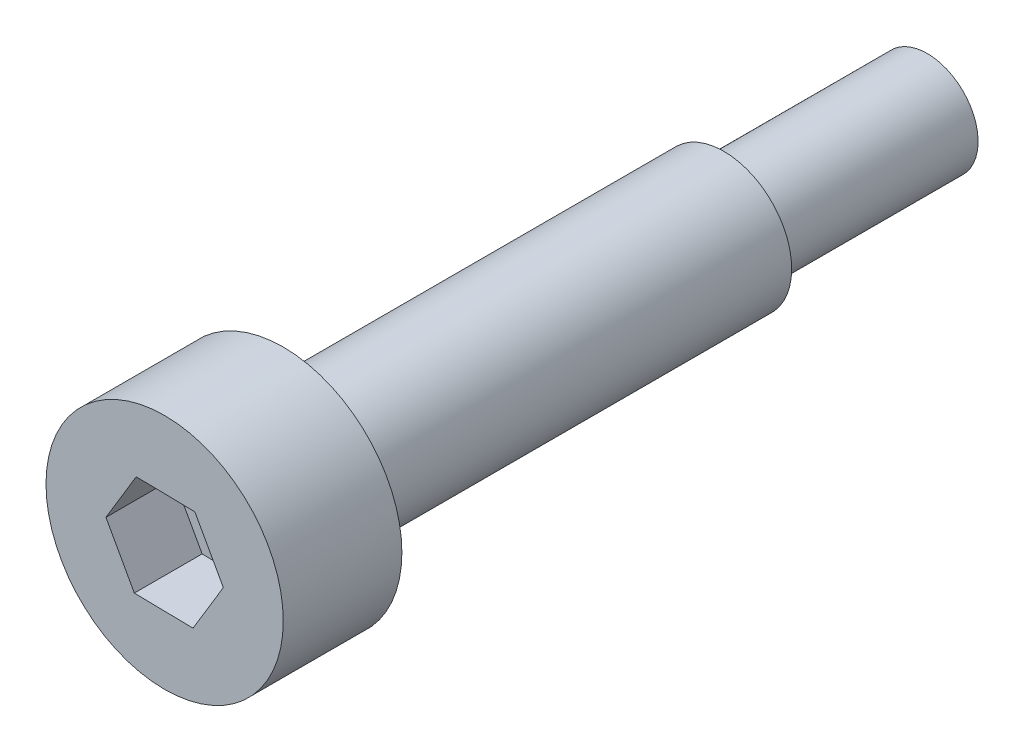
ISO-10303-21;
HEADER;
FILE_DESCRIPTION(('STEP AP214'),'2;1');
FILE_NAME('part.step','',(''),(''),'','','');
FILE_SCHEMA(('AUTOMOTIVE_DESIGN { 1 0 10303 214 1 1 1 1 }'));
ENDSEC;
DATA;
#1=APPLICATION_CONTEXT('core data for automotive mechanical design processes');
#2=APPLICATION_PROTOCOL_DEFINITION('international standard','automotive_design',2000,#1);
#3=PRODUCT_CONTEXT('',#1,'mechanical');
#4=PRODUCT('Part','Part','',(#3));
#5=PRODUCT_RELATED_PRODUCT_CATEGORY('part','',(#4));
#6=PRODUCT_DEFINITION_FORMATION('','',#4);
#7=PRODUCT_DEFINITION_CONTEXT('part definition',#1,'design');
#8=PRODUCT_DEFINITION('design','',#6,#7);
#9=PRODUCT_DEFINITION_SHAPE('','',#8);
#10=(LENGTH_UNIT() NAMED_UNIT(*) SI_UNIT(.MILLI.,.METRE.));
#11=(NAMED_UNIT(*) PLANE_ANGLE_UNIT() SI_UNIT($,.RADIAN.));
#12=(NAMED_UNIT(*) SI_UNIT($,.STERADIAN.) SOLID_ANGLE_UNIT());
#13=UNCERTAINTY_MEASURE_WITH_UNIT(LENGTH_MEASURE(1.E-05),#10,'distance_accuracy_value','');
#14=(GEOMETRIC_REPRESENTATION_CONTEXT(3) GLOBAL_UNCERTAINTY_ASSIGNED_CONTEXT((#13)) GLOBAL_UNIT_ASSIGNED_CONTEXT((#10,
#11,#12)) REPRESENTATION_CONTEXT('',''));
#15=CARTESIAN_POINT('',(0.,0.,0.));
#16=DIRECTION('',(0.,0.,1.));
#17=DIRECTION('',(1.,0.,0.));
#18=AXIS2_PLACEMENT_3D('',#15,#16,#17);
#19=CARTESIAN_POINT('',(0.,0.,3.5));
#20=DIRECTION('',(0.,0.,-1.));
#21=DIRECTION('',(-1.,0.,0.));
#22=AXIS2_PLACEMENT_3D('',#19,#20,#21);
#23=CYLINDRICAL_SURFACE('',#22,3.5);
#24=CARTESIAN_POINT('',(0.,0.,3.5));
#25=DIRECTION('',(0.,0.,1.));
#26=DIRECTION('',(1.,0.,0.));
#27=AXIS2_PLACEMENT_3D('',#24,#25,#26);
#28=CIRCLE('',#27,3.5);
#29=CARTESIAN_POINT('',(3.5,0.,3.5));
#30=VERTEX_POINT('',#29);
#31=EDGE_CURVE('E43',#30,#30,#28,.T.);
#32=ORIENTED_EDGE('',*,*,#31,.F.);
#33=EDGE_LOOP('',(#32));
#34=FACE_BOUND('',#33,.T.);
#35=CARTESIAN_POINT('',(0.,0.,0.));
#36=DIRECTION('',(0.,0.,1.));
#37=DIRECTION('',(1.,0.,0.));
#38=AXIS2_PLACEMENT_3D('',#35,#36,#37);
#39=CIRCLE('',#38,3.5);
#40=CARTESIAN_POINT('',(3.5,0.,0.));
#41=VERTEX_POINT('',#40);
#42=EDGE_CURVE('E138',#41,#41,#39,.T.);
#43=ORIENTED_EDGE('',*,*,#42,.T.);
#44=EDGE_LOOP('',(#43));
#45=FACE_BOUND('',#44,.T.);
#46=ADVANCED_FACE('F36',(#34,#45),#23,.T.);
#47=CARTESIAN_POINT('',(0.,0.,3.5));
#48=DIRECTION('',(0.,0.,1.));
#49=DIRECTION('',(1.,0.,0.));
#50=AXIS2_PLACEMENT_3D('',#47,#48,#49);
#51=PLANE('',#50);
#52=DIRECTION('',(-0.483885708586405,0.875131202178183,0.));
#53=VECTOR('',#52,1.);
#54=CARTESIAN_POINT('',(1.73175411943134,-0.0320572898511147,3.5));
#55=LINE('',#54,#53);
#56=CARTESIAN_POINT('',(1.73175411943134,-0.0320572898511147,3.5));
#57=VERTEX_POINT('',#56);
#58=CARTESIAN_POINT('',(0.893639487103215,1.48371441561033,3.5));
#59=VERTEX_POINT('',#58);
#60=EDGE_CURVE('E50',#57,#59,#55,.T.);
#61=ORIENTED_EDGE('',*,*,#60,.F.);
#62=DIRECTION('',(0.51594299843752,0.856622917253152,0.));
#63=VECTOR('',#62,1.);
#64=CARTESIAN_POINT('',(0.838114632328121,-1.51577170546145,3.5));
#65=LINE('',#64,#63);
#66=CARTESIAN_POINT('',(0.838114632328121,-1.51577170546145,3.5));
#67=VERTEX_POINT('',#66);
#68=EDGE_CURVE('E134',#67,#57,#65,.T.);
#69=ORIENTED_EDGE('',*,*,#68,.F.);
#70=DIRECTION('',(0.999828707023925,-0.0185082849250311,0.));
#71=VECTOR('',#70,1.);
#72=CARTESIAN_POINT('',(-0.893639487103214,-1.48371441561033,3.5));
#73=LINE('',#72,#71);
#74=CARTESIAN_POINT('',(-0.893639487103214,-1.48371441561033,3.5));
#75=VERTEX_POINT('',#74);
#76=EDGE_CURVE('E132',#75,#67,#73,.T.);
#77=ORIENTED_EDGE('',*,*,#76,.F.);
#78=DIRECTION('',(0.483885708586405,-0.875131202178183,0.));
#79=VECTOR('',#78,1.);
#80=CARTESIAN_POINT('',(-1.73175411943134,0.0320572898511147,3.5));
#81=LINE('',#80,#79);
#82=CARTESIAN_POINT('',(-1.73175411943134,0.0320572898511147,3.5));
#83=VERTEX_POINT('',#82);
#84=EDGE_CURVE('E98',#83,#75,#81,.T.);
#85=ORIENTED_EDGE('',*,*,#84,.F.);
#86=DIRECTION('',(-0.51594299843752,-0.856622917253152,0.));
#87=VECTOR('',#86,1.);
#88=CARTESIAN_POINT('',(-0.838114632328121,1.51577170546145,3.5));
#89=LINE('',#88,#87);
#90=CARTESIAN_POINT('',(-0.838114632328121,1.51577170546145,3.5));
#91=VERTEX_POINT('',#90);
#92=EDGE_CURVE('E128',#91,#83,#89,.T.);
#93=ORIENTED_EDGE('',*,*,#92,.F.);
#94=DIRECTION('',(-0.999828707023925,0.0185082849250311,0.));
#95=VECTOR('',#94,1.);
#96=CARTESIAN_POINT('',(0.893639487103215,1.48371441561033,3.5));
#97=LINE('',#96,#95);
#98=EDGE_CURVE('E124',#59,#91,#97,.T.);
#99=ORIENTED_EDGE('',*,*,#98,.F.);
#100=EDGE_LOOP('',(#61,#69,#77,#85,#93,#99));
#101=FACE_BOUND('',#100,.T.);
#102=ORIENTED_EDGE('',*,*,#31,.T.);
#103=EDGE_LOOP('',(#102));
#104=FACE_BOUND('',#103,.T.);
#105=ADVANCED_FACE('F152',(#101,#104),#51,.T.);
#106=CARTESIAN_POINT('',(0.,0.,0.));
#107=DIRECTION('',(0.,0.,1.));
#108=DIRECTION('',(1.,0.,0.));
#109=AXIS2_PLACEMENT_3D('',#106,#107,#108);
#110=PLANE('',#109);
#111=CARTESIAN_POINT('',(0.,0.,0.));
#112=DIRECTION('',(0.,0.,1.));
#113=DIRECTION('',(1.,0.,0.));
#114=AXIS2_PLACEMENT_3D('',#111,#112,#113);
#115=CIRCLE('',#114,2.);
#116=CARTESIAN_POINT('',(2.,0.,0.));
#117=VERTEX_POINT('',#116);
#118=EDGE_CURVE('E11',#117,#117,#115,.F.);
#119=ORIENTED_EDGE('',*,*,#118,.F.);
#120=EDGE_LOOP('',(#119));
#121=FACE_BOUND('',#120,.T.);
#122=ORIENTED_EDGE('',*,*,#42,.F.);
#123=EDGE_LOOP('',(#122));
#124=FACE_BOUND('',#123,.T.);
#125=ADVANCED_FACE('F149',(#121,#124),#110,.F.);
#126=CARTESIAN_POINT('',(1.73175411943134,-0.0320572898511147,1.5));
#127=DIRECTION('',(0.875131202178183,0.483885708586405,0.));
#128=DIRECTION('',(-0.483885708586405,0.875131202178183,0.));
#129=AXIS2_PLACEMENT_3D('',#126,#127,#128);
#130=PLANE('',#129);
#131=ORIENTED_EDGE('',*,*,#60,.T.);
#132=DIRECTION('',(0.,0.,1.));
#133=VECTOR('',#132,1.);
#134=CARTESIAN_POINT('',(0.893639487103215,1.48371441561033,1.5));
#135=LINE('',#134,#133);
#136=CARTESIAN_POINT('',(0.893639487103215,1.48371441561033,1.5));
#137=VERTEX_POINT('',#136);
#138=EDGE_CURVE('E80',#137,#59,#135,.T.);
#139=ORIENTED_EDGE('',*,*,#138,.F.);
#140=DIRECTION('',(-0.483885708586405,0.875131202178183,0.));
#141=VECTOR('',#140,1.);
#142=CARTESIAN_POINT('',(1.73175411943134,-0.0320572898511147,1.5));
#143=LINE('',#142,#141);
#144=CARTESIAN_POINT('',(1.73175411943134,-0.0320572898511147,1.5));
#145=VERTEX_POINT('',#144);
#146=EDGE_CURVE('E136',#145,#137,#143,.T.);
#147=ORIENTED_EDGE('',*,*,#146,.F.);
#148=DIRECTION('',(0.,0.,1.));
#149=VECTOR('',#148,1.);
#150=CARTESIAN_POINT('',(1.73175411943134,-0.0320572898511147,1.5));
#151=LINE('',#150,#149);
#152=EDGE_CURVE('E58',#145,#57,#151,.T.);
#153=ORIENTED_EDGE('',*,*,#152,.T.);
#154=EDGE_LOOP('',(#131,#139,#147,#153));
#155=FACE_BOUND('',#154,.T.);
#156=ADVANCED_FACE('F151',(#155),#130,.F.);
#157=CARTESIAN_POINT('',(0.838114632328121,-1.51577170546145,1.5));
#158=DIRECTION('',(0.856622917253152,-0.51594299843752,0.));
#159=DIRECTION('',(0.51594299843752,0.856622917253153,0.));
#160=AXIS2_PLACEMENT_3D('',#157,#158,#159);
#161=PLANE('',#160);
#162=ORIENTED_EDGE('',*,*,#68,.T.);
#163=ORIENTED_EDGE('',*,*,#152,.F.);
#164=DIRECTION('',(0.51594299843752,0.856622917253152,0.));
#165=VECTOR('',#164,1.);
#166=CARTESIAN_POINT('',(0.838114632328121,-1.51577170546145,1.5));
#167=LINE('',#166,#165);
#168=CARTESIAN_POINT('',(0.838114632328121,-1.51577170546145,1.5));
#169=VERTEX_POINT('',#168);
#170=EDGE_CURVE('E110',#169,#145,#167,.T.);
#171=ORIENTED_EDGE('',*,*,#170,.F.);
#172=DIRECTION('',(0.,0.,1.));
#173=VECTOR('',#172,1.);
#174=CARTESIAN_POINT('',(0.838114632328121,-1.51577170546145,1.5));
#175=LINE('',#174,#173);
#176=EDGE_CURVE('E102',#169,#67,#175,.T.);
#177=ORIENTED_EDGE('',*,*,#176,.T.);
#178=EDGE_LOOP('',(#162,#163,#171,#177));
#179=FACE_BOUND('',#178,.T.);
#180=ADVANCED_FACE('F158',(#179),#161,.F.);
#181=CARTESIAN_POINT('',(-0.893639487103214,-1.48371441561033,1.5));
#182=DIRECTION('',(-0.0185082849250311,-0.999828707023925,0.));
#183=DIRECTION('',(0.999828707023925,-0.0185082849250311,0.));
#184=AXIS2_PLACEMENT_3D('',#181,#182,#183);
#185=PLANE('',#184);
#186=ORIENTED_EDGE('',*,*,#76,.T.);
#187=ORIENTED_EDGE('',*,*,#176,.F.);
#188=DIRECTION('',(0.999828707023925,-0.0185082849250311,0.));
#189=VECTOR('',#188,1.);
#190=CARTESIAN_POINT('',(-0.893639487103214,-1.48371441561033,1.5));
#191=LINE('',#190,#189);
#192=CARTESIAN_POINT('',(-0.893639487103214,-1.48371441561033,1.5));
#193=VERTEX_POINT('',#192);
#194=EDGE_CURVE('E106',#193,#169,#191,.T.);
#195=ORIENTED_EDGE('',*,*,#194,.F.);
#196=DIRECTION('',(0.,0.,1.));
#197=VECTOR('',#196,1.);
#198=CARTESIAN_POINT('',(-0.893639487103214,-1.48371441561033,1.5));
#199=LINE('',#198,#197);
#200=EDGE_CURVE('E91',#193,#75,#199,.T.);
#201=ORIENTED_EDGE('',*,*,#200,.T.);
#202=EDGE_LOOP('',(#186,#187,#195,#201));
#203=FACE_BOUND('',#202,.T.);
#204=ADVANCED_FACE('F107',(#203),#185,.F.);
#205=CARTESIAN_POINT('',(-1.73175411943134,0.0320572898511147,1.5));
#206=DIRECTION('',(-0.875131202178183,-0.483885708586405,0.));
#207=DIRECTION('',(0.483885708586405,-0.875131202178183,0.));
#208=AXIS2_PLACEMENT_3D('',#205,#206,#207);
#209=PLANE('',#208);
#210=ORIENTED_EDGE('',*,*,#84,.T.);
#211=ORIENTED_EDGE('',*,*,#200,.F.);
#212=DIRECTION('',(0.483885708586405,-0.875131202178183,0.));
#213=VECTOR('',#212,1.);
#214=CARTESIAN_POINT('',(-1.73175411943134,0.0320572898511147,1.5));
#215=LINE('',#214,#213);
#216=CARTESIAN_POINT('',(-1.73175411943134,0.0320572898511147,1.5));
#217=VERTEX_POINT('',#216);
#218=EDGE_CURVE('E95',#217,#193,#215,.T.);
#219=ORIENTED_EDGE('',*,*,#218,.F.);
#220=DIRECTION('',(0.,0.,1.));
#221=VECTOR('',#220,1.);
#222=CARTESIAN_POINT('',(-1.73175411943134,0.0320572898511147,1.5));
#223=LINE('',#222,#221);
#224=EDGE_CURVE('E103',#217,#83,#223,.T.);
#225=ORIENTED_EDGE('',*,*,#224,.T.);
#226=EDGE_LOOP('',(#210,#211,#219,#225));
#227=FACE_BOUND('',#226,.T.);
#228=ADVANCED_FACE('F93',(#227),#209,.F.);
#229=CARTESIAN_POINT('',(-0.838114632328121,1.51577170546145,1.5));
#230=DIRECTION('',(-0.856622917253152,0.51594299843752,0.));
#231=DIRECTION('',(-0.51594299843752,-0.856622917253153,0.));
#232=AXIS2_PLACEMENT_3D('',#229,#230,#231);
#233=PLANE('',#232);
#234=ORIENTED_EDGE('',*,*,#92,.T.);
#235=ORIENTED_EDGE('',*,*,#224,.F.);
#236=DIRECTION('',(-0.51594299843752,-0.856622917253152,0.));
#237=VECTOR('',#236,1.);
#238=CARTESIAN_POINT('',(-0.838114632328121,1.51577170546145,1.5));
#239=LINE('',#238,#237);
#240=CARTESIAN_POINT('',(-0.838114632328121,1.51577170546145,1.5));
#241=VERTEX_POINT('',#240);
#242=EDGE_CURVE('E116',#241,#217,#239,.T.);
#243=ORIENTED_EDGE('',*,*,#242,.F.);
#244=DIRECTION('',(0.,0.,1.));
#245=VECTOR('',#244,1.);
#246=CARTESIAN_POINT('',(-0.838114632328121,1.51577170546145,1.5));
#247=LINE('',#246,#245);
#248=EDGE_CURVE('E141',#241,#91,#247,.T.);
#249=ORIENTED_EDGE('',*,*,#248,.T.);
#250=EDGE_LOOP('',(#234,#235,#243,#249));
#251=FACE_BOUND('',#250,.T.);
#252=ADVANCED_FACE('F205',(#251),#233,.F.);
#253=CARTESIAN_POINT('',(0.893639487103215,1.48371441561033,1.5));
#254=DIRECTION('',(0.0185082849250311,0.999828707023925,0.));
#255=DIRECTION('',(-0.999828707023925,0.0185082849250311,0.));
#256=AXIS2_PLACEMENT_3D('',#253,#254,#255);
#257=PLANE('',#256);
#258=ORIENTED_EDGE('',*,*,#98,.T.);
#259=ORIENTED_EDGE('',*,*,#248,.F.);
#260=DIRECTION('',(-0.999828707023925,0.0185082849250311,0.));
#261=VECTOR('',#260,1.);
#262=CARTESIAN_POINT('',(0.893639487103215,1.48371441561033,1.5));
#263=LINE('',#262,#261);
#264=EDGE_CURVE('E118',#137,#241,#263,.T.);
#265=ORIENTED_EDGE('',*,*,#264,.F.);
#266=ORIENTED_EDGE('',*,*,#138,.T.);
#267=EDGE_LOOP('',(#258,#259,#265,#266));
#268=FACE_BOUND('',#267,.T.);
#269=ADVANCED_FACE('F214',(#268),#257,.F.);
#270=CARTESIAN_POINT('',(0.,0.,1.5));
#271=DIRECTION('',(0.,0.,1.));
#272=DIRECTION('',(1.,0.,0.));
#273=AXIS2_PLACEMENT_3D('',#270,#271,#272);
#274=PLANE('',#273);
#275=ORIENTED_EDGE('',*,*,#146,.T.);
#276=ORIENTED_EDGE('',*,*,#264,.T.);
#277=ORIENTED_EDGE('',*,*,#242,.T.);
#278=ORIENTED_EDGE('',*,*,#218,.T.);
#279=ORIENTED_EDGE('',*,*,#194,.T.);
#280=ORIENTED_EDGE('',*,*,#170,.T.);
#281=EDGE_LOOP('',(#275,#276,#277,#278,#279,#280));
#282=FACE_BOUND('',#281,.T.);
#283=ADVANCED_FACE('F113',(#282),#274,.T.);
#284=CARTESIAN_POINT('',(0.,0.,-13.));
#285=DIRECTION('',(0.,0.,1.));
#286=DIRECTION('',(1.,0.,0.));
#287=AXIS2_PLACEMENT_3D('',#284,#285,#286);
#288=CYLINDRICAL_SURFACE('',#287,2.);
#289=CARTESIAN_POINT('',(0.,0.,-13.));
#290=DIRECTION('',(0.,0.,-1.));
#291=DIRECTION('',(-1.,0.,0.));
#292=AXIS2_PLACEMENT_3D('',#289,#290,#291);
#293=CIRCLE('',#292,2.);
#294=CARTESIAN_POINT('',(2.,0.,-13.));
#295=VERTEX_POINT('',#294);
#296=EDGE_CURVE('E125',#295,#295,#293,.T.);
#297=CARTESIAN_POINT('',(2.,0.,-13.));
#298=CARTESIAN_POINT('',(2.,0.,-12.8645833333333));
#299=CARTESIAN_POINT('',(2.,0.,-12.7291666666667));
#300=CARTESIAN_POINT('',(2.,0.,-12.4583333333333));
#301=CARTESIAN_POINT('',(2.,0.,-12.3229166666667));
#302=CARTESIAN_POINT('',(2.,0.,-12.0520833333333));
#303=CARTESIAN_POINT('',(2.,0.,-11.9166666666667));
#304=CARTESIAN_POINT('',(2.,0.,-11.6458333333333));
#305=CARTESIAN_POINT('',(2.,0.,-11.5104166666667));
#306=CARTESIAN_POINT('',(2.,0.,-11.2395833333333));
#307=CARTESIAN_POINT('',(2.,0.,-11.1041666666667));
#308=CARTESIAN_POINT('',(2.,0.,-10.8333333333333));
#309=CARTESIAN_POINT('',(2.,0.,-10.6979166666667));
#310=CARTESIAN_POINT('',(2.,0.,-10.4270833333333));
#311=CARTESIAN_POINT('',(2.,0.,-10.2916666666667));
#312=CARTESIAN_POINT('',(2.,0.,-10.0208333333333));
#313=CARTESIAN_POINT('',(2.,0.,-9.88541666666667));
#314=CARTESIAN_POINT('',(2.,0.,-9.61458333333333));
#315=CARTESIAN_POINT('',(2.,0.,-9.47916666666667));
#316=CARTESIAN_POINT('',(2.,0.,-9.20833333333333));
#317=CARTESIAN_POINT('',(2.,0.,-9.07291666666666));
#318=CARTESIAN_POINT('',(2.,0.,-8.80208333333333));
#319=CARTESIAN_POINT('',(2.,0.,-8.66666666666667));
#320=CARTESIAN_POINT('',(2.,0.,-8.39583333333333));
#321=CARTESIAN_POINT('',(2.,0.,-8.26041666666667));
#322=CARTESIAN_POINT('',(2.,0.,-7.98958333333333));
#323=CARTESIAN_POINT('',(2.,0.,-7.85416666666667));
#324=CARTESIAN_POINT('',(2.,0.,-7.58333333333333));
#325=CARTESIAN_POINT('',(2.,0.,-7.44791666666667));
#326=CARTESIAN_POINT('',(2.,0.,-7.17708333333333));
#327=CARTESIAN_POINT('',(2.,0.,-7.04166666666667));
#328=CARTESIAN_POINT('',(2.,0.,-6.77083333333333));
#329=CARTESIAN_POINT('',(2.,0.,-6.63541666666667));
#330=CARTESIAN_POINT('',(2.,0.,-6.36458333333333));
#331=CARTESIAN_POINT('',(2.,0.,-6.22916666666667));
#332=CARTESIAN_POINT('',(2.,0.,-5.95833333333333));
#333=CARTESIAN_POINT('',(2.,0.,-5.82291666666667));
#334=CARTESIAN_POINT('',(2.,0.,-5.55208333333333));
#335=CARTESIAN_POINT('',(2.,0.,-5.41666666666667));
#336=CARTESIAN_POINT('',(2.,0.,-5.14583333333333));
#337=CARTESIAN_POINT('',(2.,0.,-5.01041666666667));
#338=CARTESIAN_POINT('',(2.,0.,-4.73958333333333));
#339=CARTESIAN_POINT('',(2.,0.,-4.60416666666667));
#340=CARTESIAN_POINT('',(2.,0.,-4.33333333333333));
#341=CARTESIAN_POINT('',(2.,0.,-4.19791666666667));
#342=CARTESIAN_POINT('',(2.,0.,-3.92708333333333));
#343=CARTESIAN_POINT('',(2.,0.,-3.79166666666667));
#344=CARTESIAN_POINT('',(2.,0.,-3.52083333333333));
#345=CARTESIAN_POINT('',(2.,0.,-3.38541666666667));
#346=CARTESIAN_POINT('',(2.,0.,-3.11458333333333));
#347=CARTESIAN_POINT('',(2.,0.,-2.97916666666667));
#348=CARTESIAN_POINT('',(2.,0.,-2.70833333333333));
#349=CARTESIAN_POINT('',(2.,0.,-2.57291666666667));
#350=CARTESIAN_POINT('',(2.,0.,-2.30208333333333));
#351=CARTESIAN_POINT('',(2.,0.,-2.16666666666667));
#352=CARTESIAN_POINT('',(2.,0.,-1.89583333333333));
#353=CARTESIAN_POINT('',(2.,0.,-1.76041666666667));
#354=CARTESIAN_POINT('',(2.,0.,-1.48958333333333));
#355=CARTESIAN_POINT('',(2.,0.,-1.35416666666667));
#356=CARTESIAN_POINT('',(2.,0.,-1.08333333333333));
#357=CARTESIAN_POINT('',(2.,0.,-0.947916666666667));
#358=CARTESIAN_POINT('',(2.,0.,-0.677083333333334));
#359=CARTESIAN_POINT('',(2.,0.,-0.541666666666667));
#360=CARTESIAN_POINT('',(2.,0.,-0.270833333333334));
#361=CARTESIAN_POINT('',(2.,0.,-0.135416666666667));
#362=CARTESIAN_POINT('',(2.,0.,0.));
#363=B_SPLINE_CURVE_WITH_KNOTS('',3,(#297,#298,#299,#300,#301,#302,#303,#304,#305,#306,#307,
#308,#309,#310,#311,#312,#313,#314,#315,#316,#317,#318,#319,#320,#321,#322,#323,#324,#325,#326,
#327,#328,#329,#330,#331,#332,#333,#334,#335,#336,#337,#338,#339,#340,#341,#342,#343,#344,#345,
#346,#347,#348,#349,#350,#351,#352,#353,#354,#355,#356,#357,#358,#359,#360,#361,#362),
.UNSPECIFIED.,.F.,.F.,(4,2,2,2,2,2,2,2,2,2,2,2,2,2,2,2,2,2,2,2,2,2,2,2,2,2,2,2,2,2,2,2,4),(0.,
0.40625,0.812500000000001,1.21875,1.625,2.03125,2.4375,2.84375,3.25,3.65625,4.0625,4.46875,
4.875,5.28125,5.6875,6.09375,6.5,6.90625,7.3125,7.71875,8.125,8.53125,8.9375,9.34375,9.75,
10.15625,10.5625,10.96875,11.375,11.78125,12.1875,12.59375,13.),.UNSPECIFIED.);
#364=EDGE_CURVE('BSEAM232',#295,#117,#363,.T.);
#365=ORIENTED_EDGE('',*,*,#296,.F.);
#366=ORIENTED_EDGE('',*,*,#118,.T.);
#367=ORIENTED_EDGE('',*,*,#364,.T.);
#368=ORIENTED_EDGE('',*,*,#364,.F.);
#369=EDGE_LOOP('',(#365,#367,#366,#368));
#370=FACE_BOUND('',#369,.T.);
#371=ADVANCED_FACE('F232',(#370),#288,.T.);
#372=CARTESIAN_POINT('',(0.,0.,-13.));
#373=DIRECTION('',(0.,0.,-1.));
#374=DIRECTION('',(-1.,0.,0.));
#375=AXIS2_PLACEMENT_3D('',#372,#373,#374);
#376=PLANE('',#375);
#377=CARTESIAN_POINT('',(0.,0.,-13.));
#378=DIRECTION('',(0.,0.,-1.));
#379=DIRECTION('',(-1.,0.,0.));
#380=AXIS2_PLACEMENT_3D('',#377,#378,#379);
#381=CIRCLE('',#380,1.5);
#382=CARTESIAN_POINT('',(-1.5,0.,-13.));
#383=VERTEX_POINT('',#382);
#384=EDGE_CURVE('E284',#383,#383,#381,.T.);
#385=ORIENTED_EDGE('',*,*,#384,.F.);
#386=EDGE_LOOP('',(#385));
#387=FACE_BOUND('',#386,.T.);
#388=ORIENTED_EDGE('',*,*,#296,.T.);
#389=EDGE_LOOP('',(#388));
#390=FACE_BOUND('',#389,.T.);
#391=ADVANCED_FACE('F245',(#387,#390),#376,.T.);
#392=CARTESIAN_POINT('',(0.,0.,-19.));
#393=DIRECTION('',(0.,0.,1.));
#394=DIRECTION('',(1.,0.,0.));
#395=AXIS2_PLACEMENT_3D('',#392,#393,#394);
#396=CYLINDRICAL_SURFACE('',#395,1.5);
#397=CARTESIAN_POINT('',(0.,0.,-19.));
#398=DIRECTION('',(0.,0.,-1.));
#399=DIRECTION('',(-1.,0.,0.));
#400=AXIS2_PLACEMENT_3D('',#397,#398,#399);
#401=CIRCLE('',#400,1.5);
#402=CARTESIAN_POINT('',(-1.5,0.,-19.));
#403=VERTEX_POINT('',#402);
#404=EDGE_CURVE('E283',#403,#403,#401,.T.);
#405=ORIENTED_EDGE('',*,*,#404,.F.);
#406=EDGE_LOOP('',(#405));
#407=FACE_BOUND('',#406,.T.);
#408=ORIENTED_EDGE('',*,*,#384,.T.);
#409=EDGE_LOOP('',(#408));
#410=FACE_BOUND('',#409,.T.);
#411=ADVANCED_FACE('F255',(#407,#410),#396,.T.);
#412=CARTESIAN_POINT('',(0.,0.,-19.));
#413=DIRECTION('',(0.,0.,-1.));
#414=DIRECTION('',(-1.,0.,0.));
#415=AXIS2_PLACEMENT_3D('',#412,#413,#414);
#416=PLANE('',#415);
#417=ORIENTED_EDGE('',*,*,#404,.T.);
#418=EDGE_LOOP('',(#417));
#419=FACE_BOUND('',#418,.T.);
#420=ADVANCED_FACE('F266',(#419),#416,.T.);
#421=CLOSED_SHELL('',(#46,#105,#125,#156,#180,#204,#228,#252,#269,#283,#371,#391,#411,#420));
#422=MANIFOLD_SOLID_BREP('B2',#421);
#423=ADVANCED_BREP_SHAPE_REPRESENTATION('',(#18,#422),#14);
#424=SHAPE_DEFINITION_REPRESENTATION(#9,#423);
ENDSEC;
END-ISO-10303-21;
